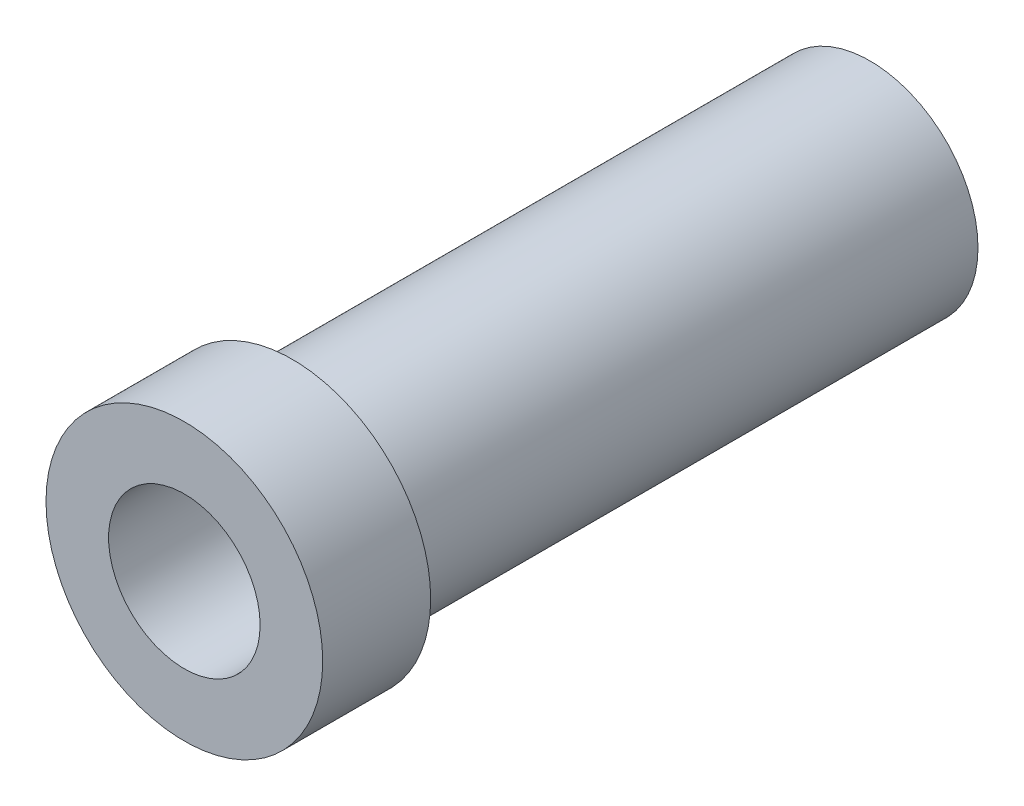
ISO-10303-21;
HEADER;
FILE_DESCRIPTION(('STEP AP214'),'2;1');
FILE_NAME('part.step','',(''),(''),'','','');
FILE_SCHEMA(('AUTOMOTIVE_DESIGN { 1 0 10303 214 1 1 1 1 }'));
ENDSEC;
DATA;
#1=APPLICATION_CONTEXT('core data for automotive mechanical design processes');
#2=APPLICATION_PROTOCOL_DEFINITION('international standard','automotive_design',2000,#1);
#3=PRODUCT_CONTEXT('',#1,'mechanical');
#4=PRODUCT('Part','Part','',(#3));
#5=PRODUCT_RELATED_PRODUCT_CATEGORY('part','',(#4));
#6=PRODUCT_DEFINITION_FORMATION('','',#4);
#7=PRODUCT_DEFINITION_CONTEXT('part definition',#1,'design');
#8=PRODUCT_DEFINITION('design','',#6,#7);
#9=PRODUCT_DEFINITION_SHAPE('','',#8);
#10=(LENGTH_UNIT() NAMED_UNIT(*) SI_UNIT(.MILLI.,.METRE.));
#11=(NAMED_UNIT(*) PLANE_ANGLE_UNIT() SI_UNIT($,.RADIAN.));
#12=(NAMED_UNIT(*) SI_UNIT($,.STERADIAN.) SOLID_ANGLE_UNIT());
#13=UNCERTAINTY_MEASURE_WITH_UNIT(LENGTH_MEASURE(1.E-05),#10,'distance_accuracy_value','');
#14=(GEOMETRIC_REPRESENTATION_CONTEXT(3) GLOBAL_UNCERTAINTY_ASSIGNED_CONTEXT((#13)) GLOBAL_UNIT_ASSIGNED_CONTEXT((#10,
#11,#12)) REPRESENTATION_CONTEXT('',''));
#15=CARTESIAN_POINT('',(0.,0.,0.));
#16=DIRECTION('',(0.,0.,1.));
#17=DIRECTION('',(1.,0.,0.));
#18=AXIS2_PLACEMENT_3D('',#15,#16,#17);
#19=CARTESIAN_POINT('',(0.,0.,12.7));
#20=DIRECTION('',(0.,0.,-1.));
#21=DIRECTION('',(-1.,0.,0.));
#22=AXIS2_PLACEMENT_3D('',#19,#20,#21);
#23=CYLINDRICAL_SURFACE('',#22,4.);
#24=CARTESIAN_POINT('',(0.,0.,8.2));
#25=DIRECTION('',(0.,0.,1.));
#26=DIRECTION('',(1.,0.,0.));
#27=AXIS2_PLACEMENT_3D('',#24,#25,#26);
#28=CIRCLE('',#27,4.);
#29=CARTESIAN_POINT('',(4.,0.,8.2));
#30=VERTEX_POINT('',#29);
#31=EDGE_CURVE('E10',#30,#30,#28,.F.);
#32=ORIENTED_EDGE('',*,*,#31,.T.);
#33=EDGE_LOOP('',(#32));
#34=FACE_BOUND('',#33,.T.);
#35=CARTESIAN_POINT('',(0.,0.,-12.7));
#36=DIRECTION('',(0.,0.,1.));
#37=DIRECTION('',(1.,0.,0.));
#38=AXIS2_PLACEMENT_3D('',#35,#36,#37);
#39=CIRCLE('',#38,4.);
#40=CARTESIAN_POINT('',(4.,0.,-12.7));
#41=VERTEX_POINT('',#40);
#42=EDGE_CURVE('E43',#41,#41,#39,.T.);
#43=ORIENTED_EDGE('',*,*,#42,.T.);
#44=EDGE_LOOP('',(#43));
#45=FACE_BOUND('',#44,.T.);
#46=ADVANCED_FACE('F32',(#34,#45),#23,.T.);
#47=CARTESIAN_POINT('',(0.,0.,12.7));
#48=DIRECTION('',(0.,0.,1.));
#49=DIRECTION('',(1.,0.,0.));
#50=AXIS2_PLACEMENT_3D('',#47,#48,#49);
#51=PLANE('',#50);
#52=CARTESIAN_POINT('',(0.,0.,12.7));
#53=DIRECTION('',(0.,0.,1.));
#54=DIRECTION('',(1.,0.,0.));
#55=AXIS2_PLACEMENT_3D('',#52,#53,#54);
#56=CIRCLE('',#55,2.8067);
#57=CARTESIAN_POINT('',(2.8067,0.,12.7));
#58=VERTEX_POINT('',#57);
#59=EDGE_CURVE('E52',#58,#58,#56,.T.);
#60=ORIENTED_EDGE('',*,*,#59,.F.);
#61=EDGE_LOOP('',(#60));
#62=FACE_BOUND('',#61,.T.);
#63=CARTESIAN_POINT('',(0.,0.,12.7));
#64=DIRECTION('',(0.,0.,1.));
#65=DIRECTION('',(1.,0.,0.));
#66=AXIS2_PLACEMENT_3D('',#63,#64,#65);
#67=CIRCLE('',#66,5.12499999999999);
#68=CARTESIAN_POINT('',(5.12499999999999,0.,12.7));
#69=VERTEX_POINT('',#68);
#70=EDGE_CURVE('E56',#69,#69,#67,.T.);
#71=ORIENTED_EDGE('',*,*,#70,.T.);
#72=EDGE_LOOP('',(#71));
#73=FACE_BOUND('',#72,.T.);
#74=ADVANCED_FACE('F78',(#62,#73),#51,.T.);
#75=CARTESIAN_POINT('',(0.,0.,-12.7));
#76=DIRECTION('',(0.,0.,1.));
#77=DIRECTION('',(1.,0.,0.));
#78=AXIS2_PLACEMENT_3D('',#75,#76,#77);
#79=PLANE('',#78);
#80=CARTESIAN_POINT('',(0.,0.,-12.7));
#81=DIRECTION('',(0.,0.,1.));
#82=DIRECTION('',(1.,0.,0.));
#83=AXIS2_PLACEMENT_3D('',#80,#81,#82);
#84=CIRCLE('',#83,2.80669999999999);
#85=CARTESIAN_POINT('',(2.80669999999999,0.,-12.7));
#86=VERTEX_POINT('',#85);
#87=EDGE_CURVE('E47',#86,#86,#84,.T.);
#88=ORIENTED_EDGE('',*,*,#87,.T.);
#89=EDGE_LOOP('',(#88));
#90=FACE_BOUND('',#89,.T.);
#91=ORIENTED_EDGE('',*,*,#42,.F.);
#92=EDGE_LOOP('',(#91));
#93=FACE_BOUND('',#92,.T.);
#94=ADVANCED_FACE('F74',(#90,#93),#79,.F.);
#95=CARTESIAN_POINT('',(0.,0.,12.7));
#96=DIRECTION('',(0.,0.,1.));
#97=DIRECTION('',(1.,0.,0.));
#98=AXIS2_PLACEMENT_3D('',#95,#96,#97);
#99=CYLINDRICAL_SURFACE('',#98,2.8067);
#100=ORIENTED_EDGE('',*,*,#59,.T.);
#101=EDGE_LOOP('',(#100));
#102=FACE_BOUND('',#101,.T.);
#103=ORIENTED_EDGE('',*,*,#87,.F.);
#104=EDGE_LOOP('',(#103));
#105=FACE_BOUND('',#104,.T.);
#106=ADVANCED_FACE('F67',(#102,#105),#99,.F.);
#107=CARTESIAN_POINT('',(0.,0.,8.7));
#108=DIRECTION('',(0.,0.,1.));
#109=DIRECTION('',(1.,0.,0.));
#110=AXIS2_PLACEMENT_3D('',#107,#108,#109);
#111=PLANE('',#110);
#112=CARTESIAN_POINT('',(0.,0.,8.7));
#113=DIRECTION('',(0.,0.,1.));
#114=DIRECTION('',(1.,0.,0.));
#115=AXIS2_PLACEMENT_3D('',#112,#113,#114);
#116=CIRCLE('',#115,4.5);
#117=CARTESIAN_POINT('',(4.5,0.,8.7));
#118=VERTEX_POINT('',#117);
#119=EDGE_CURVE('E39',#118,#118,#116,.T.);
#120=ORIENTED_EDGE('',*,*,#119,.T.);
#121=EDGE_LOOP('',(#120));
#122=FACE_BOUND('',#121,.T.);
#123=CARTESIAN_POINT('',(0.,0.,8.7));
#124=DIRECTION('',(0.,0.,1.));
#125=DIRECTION('',(1.,0.,0.));
#126=AXIS2_PLACEMENT_3D('',#123,#124,#125);
#127=CIRCLE('',#126,5.12499999999999);
#128=CARTESIAN_POINT('',(5.12499999999999,0.,8.7));
#129=VERTEX_POINT('',#128);
#130=EDGE_CURVE('E55',#129,#129,#127,.T.);
#131=ORIENTED_EDGE('',*,*,#130,.F.);
#132=EDGE_LOOP('',(#131));
#133=FACE_BOUND('',#132,.T.);
#134=ADVANCED_FACE('F65',(#122,#133),#111,.F.);
#135=CARTESIAN_POINT('',(0.,0.,8.7));
#136=DIRECTION('',(0.,0.,1.));
#137=DIRECTION('',(1.,0.,0.));
#138=AXIS2_PLACEMENT_3D('',#135,#136,#137);
#139=CYLINDRICAL_SURFACE('',#138,5.12499999999999);
#140=ORIENTED_EDGE('',*,*,#130,.T.);
#141=EDGE_LOOP('',(#140));
#142=FACE_BOUND('',#141,.T.);
#143=ORIENTED_EDGE('',*,*,#70,.F.);
#144=EDGE_LOOP('',(#143));
#145=FACE_BOUND('',#144,.T.);
#146=ADVANCED_FACE('F62',(#142,#145),#139,.T.);
#147=CARTESIAN_POINT('',(0.,0.,8.2));
#148=DIRECTION('',(0.,0.,1.));
#149=DIRECTION('',(1.,0.,0.));
#150=AXIS2_PLACEMENT_3D('',#147,#148,#149);
#151=TOROIDAL_SURFACE('',#150,4.5,0.5);
#152=ORIENTED_EDGE('',*,*,#31,.F.);
#153=EDGE_LOOP('',(#152));
#154=FACE_BOUND('',#153,.T.);
#155=ORIENTED_EDGE('',*,*,#119,.F.);
#156=EDGE_LOOP('',(#155));
#157=FACE_BOUND('',#156,.T.);
#158=ADVANCED_FACE('F34',(#154,#157),#151,.F.);
#159=CLOSED_SHELL('',(#46,#74,#94,#106,#134,#146,#158));
#160=MANIFOLD_SOLID_BREP('B2',#159);
#161=ADVANCED_BREP_SHAPE_REPRESENTATION('',(#18,#160),#14);
#162=SHAPE_DEFINITION_REPRESENTATION(#9,#161);
ENDSEC;
END-ISO-10303-21;
